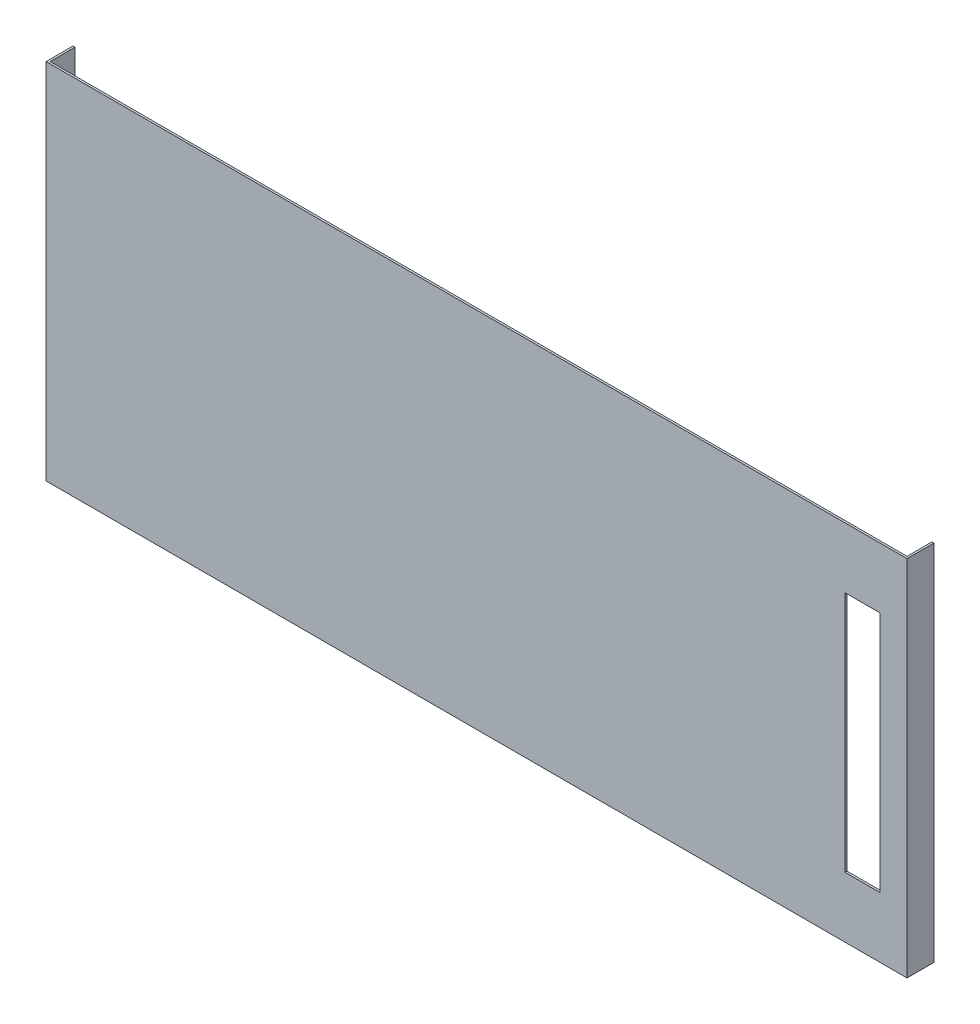
ISO-10303-21;
HEADER;
FILE_DESCRIPTION(('STEP AP214'),'2;1');
FILE_NAME('part.step','',(''),(''),'','','');
FILE_SCHEMA(('AUTOMOTIVE_DESIGN { 1 0 10303 214 1 1 1 1 }'));
ENDSEC;
DATA;
#1=APPLICATION_CONTEXT('core data for automotive mechanical design processes');
#2=APPLICATION_PROTOCOL_DEFINITION('international standard','automotive_design',2000,#1);
#3=PRODUCT_CONTEXT('',#1,'mechanical');
#4=PRODUCT('Part','Part','',(#3));
#5=PRODUCT_RELATED_PRODUCT_CATEGORY('part','',(#4));
#6=PRODUCT_DEFINITION_FORMATION('','',#4);
#7=PRODUCT_DEFINITION_CONTEXT('part definition',#1,'design');
#8=PRODUCT_DEFINITION('design','',#6,#7);
#9=PRODUCT_DEFINITION_SHAPE('','',#8);
#10=(LENGTH_UNIT() NAMED_UNIT(*) SI_UNIT(.MILLI.,.METRE.));
#11=(NAMED_UNIT(*) PLANE_ANGLE_UNIT() SI_UNIT($,.RADIAN.));
#12=(NAMED_UNIT(*) SI_UNIT($,.STERADIAN.) SOLID_ANGLE_UNIT());
#13=UNCERTAINTY_MEASURE_WITH_UNIT(LENGTH_MEASURE(1.E-05),#10,'distance_accuracy_value','');
#14=(GEOMETRIC_REPRESENTATION_CONTEXT(3) GLOBAL_UNCERTAINTY_ASSIGNED_CONTEXT((#13)) GLOBAL_UNIT_ASSIGNED_CONTEXT((#10,
#11,#12)) REPRESENTATION_CONTEXT('',''));
#15=CARTESIAN_POINT('',(0.,0.,0.));
#16=DIRECTION('',(0.,0.,1.));
#17=DIRECTION('',(1.,0.,0.));
#18=AXIS2_PLACEMENT_3D('',#15,#16,#17);
#19=CARTESIAN_POINT('',(670.,1950.,40.));
#20=DIRECTION('',(0.,0.,-1.));
#21=DIRECTION('',(-1.,0.,0.));
#22=AXIS2_PLACEMENT_3D('',#19,#20,#21);
#23=PLANE('',#22);
#24=DIRECTION('',(1.,0.,0.));
#25=VECTOR('',#24,1.);
#26=CARTESIAN_POINT('',(670.,1680.,40.));
#27=LINE('',#26,#25);
#28=CARTESIAN_POINT('',(30.,1680.,40.));
#29=VERTEX_POINT('',#28);
#30=CARTESIAN_POINT('',(670.,1680.,40.));
#31=VERTEX_POINT('',#30);
#32=EDGE_CURVE('E141',#29,#31,#27,.T.);
#33=ORIENTED_EDGE('',*,*,#32,.T.);
#34=DIRECTION('',(0.,-1.,0.));
#35=VECTOR('',#34,1.);
#36=CARTESIAN_POINT('',(670.,1950.,40.));
#37=LINE('',#36,#35);
#38=CARTESIAN_POINT('',(670.,1950.,40.));
#39=VERTEX_POINT('',#38);
#40=EDGE_CURVE('E200',#39,#31,#37,.T.);
#41=ORIENTED_EDGE('',*,*,#40,.F.);
#42=DIRECTION('',(1.,0.,0.));
#43=VECTOR('',#42,1.);
#44=CARTESIAN_POINT('',(670.,1950.,40.));
#45=LINE('',#44,#43);
#46=CARTESIAN_POINT('',(30.,1950.,40.));
#47=VERTEX_POINT('',#46);
#48=EDGE_CURVE('E149',#47,#39,#45,.T.);
#49=ORIENTED_EDGE('',*,*,#48,.F.);
#50=DIRECTION('',(0.,-1.,0.));
#51=VECTOR('',#50,1.);
#52=CARTESIAN_POINT('',(30.,1950.,40.));
#53=LINE('',#52,#51);
#54=EDGE_CURVE('E166',#47,#29,#53,.T.);
#55=ORIENTED_EDGE('',*,*,#54,.T.);
#56=EDGE_LOOP('',(#33,#41,#49,#55));
#57=FACE_BOUND('',#56,.T.);
#58=DIRECTION('',(0.,-1.,0.));
#59=VECTOR('',#58,1.);
#60=CARTESIAN_POINT('',(624.,1950.,40.));
#61=LINE('',#60,#59);
#62=CARTESIAN_POINT('',(624.,1905.,40.));
#63=VERTEX_POINT('',#62);
#64=CARTESIAN_POINT('',(624.,1725.,40.));
#65=VERTEX_POINT('',#64);
#66=EDGE_CURVE('E134',#63,#65,#61,.T.);
#67=ORIENTED_EDGE('',*,*,#66,.F.);
#68=DIRECTION('',(-1.,0.,0.));
#69=VECTOR('',#68,1.);
#70=CARTESIAN_POINT('',(670.,1905.,40.));
#71=LINE('',#70,#69);
#72=CARTESIAN_POINT('',(650.,1905.,40.));
#73=VERTEX_POINT('',#72);
#74=EDGE_CURVE('E123',#73,#63,#71,.T.);
#75=ORIENTED_EDGE('',*,*,#74,.F.);
#76=DIRECTION('',(0.,1.,0.));
#77=VECTOR('',#76,1.);
#78=CARTESIAN_POINT('',(650.,1950.,40.));
#79=LINE('',#78,#77);
#80=CARTESIAN_POINT('',(650.,1725.,40.));
#81=VERTEX_POINT('',#80);
#82=EDGE_CURVE('E128',#81,#73,#79,.T.);
#83=ORIENTED_EDGE('',*,*,#82,.F.);
#84=DIRECTION('',(1.,0.,0.));
#85=VECTOR('',#84,1.);
#86=CARTESIAN_POINT('',(670.,1725.,40.));
#87=LINE('',#86,#85);
#88=EDGE_CURVE('E140',#65,#81,#87,.T.);
#89=ORIENTED_EDGE('',*,*,#88,.F.);
#90=EDGE_LOOP('',(#67,#75,#83,#89));
#91=FACE_BOUND('',#90,.T.);
#92=ADVANCED_FACE('F39',(#57,#91),#23,.F.);
#93=CARTESIAN_POINT('',(31.5,1950.,38.5));
#94=DIRECTION('',(0.,0.,1.));
#95=DIRECTION('',(1.,0.,0.));
#96=AXIS2_PLACEMENT_3D('',#93,#94,#95);
#97=PLANE('',#96);
#98=DIRECTION('',(-1.,0.,0.));
#99=VECTOR('',#98,1.);
#100=CARTESIAN_POINT('',(31.5,1680.,38.5));
#101=LINE('',#100,#99);
#102=CARTESIAN_POINT('',(668.5,1680.,38.5));
#103=VERTEX_POINT('',#102);
#104=CARTESIAN_POINT('',(31.5,1680.,38.5));
#105=VERTEX_POINT('',#104);
#106=EDGE_CURVE('E173',#103,#105,#101,.T.);
#107=ORIENTED_EDGE('',*,*,#106,.T.);
#108=DIRECTION('',(0.,-1.,0.));
#109=VECTOR('',#108,1.);
#110=CARTESIAN_POINT('',(31.5,1950.,38.5));
#111=LINE('',#110,#109);
#112=CARTESIAN_POINT('',(31.5,1950.,38.5));
#113=VERTEX_POINT('',#112);
#114=EDGE_CURVE('E188',#113,#105,#111,.T.);
#115=ORIENTED_EDGE('',*,*,#114,.F.);
#116=DIRECTION('',(-1.,0.,0.));
#117=VECTOR('',#116,1.);
#118=CARTESIAN_POINT('',(31.5,1950.,38.5));
#119=LINE('',#118,#117);
#120=CARTESIAN_POINT('',(668.5,1950.,38.5));
#121=VERTEX_POINT('',#120);
#122=EDGE_CURVE('E159',#121,#113,#119,.T.);
#123=ORIENTED_EDGE('',*,*,#122,.F.);
#124=DIRECTION('',(0.,-1.,0.));
#125=VECTOR('',#124,1.);
#126=CARTESIAN_POINT('',(668.5,1950.,38.5));
#127=LINE('',#126,#125);
#128=EDGE_CURVE('E191',#121,#103,#127,.T.);
#129=ORIENTED_EDGE('',*,*,#128,.T.);
#130=EDGE_LOOP('',(#107,#115,#123,#129));
#131=FACE_BOUND('',#130,.T.);
#132=DIRECTION('',(0.,1.,0.));
#133=VECTOR('',#132,1.);
#134=CARTESIAN_POINT('',(624.,1950.,38.5));
#135=LINE('',#134,#133);
#136=CARTESIAN_POINT('',(624.,1725.,38.5));
#137=VERTEX_POINT('',#136);
#138=CARTESIAN_POINT('',(624.,1905.,38.5));
#139=VERTEX_POINT('',#138);
#140=EDGE_CURVE('E11',#137,#139,#135,.T.);
#141=ORIENTED_EDGE('',*,*,#140,.F.);
#142=DIRECTION('',(-1.,0.,0.));
#143=VECTOR('',#142,1.);
#144=CARTESIAN_POINT('',(31.5,1725.,38.5));
#145=LINE('',#144,#143);
#146=CARTESIAN_POINT('',(650.,1725.,38.5));
#147=VERTEX_POINT('',#146);
#148=EDGE_CURVE('E46',#147,#137,#145,.T.);
#149=ORIENTED_EDGE('',*,*,#148,.F.);
#150=DIRECTION('',(0.,-1.,0.));
#151=VECTOR('',#150,1.);
#152=CARTESIAN_POINT('',(650.,1950.,38.5));
#153=LINE('',#152,#151);
#154=CARTESIAN_POINT('',(650.,1905.,38.5));
#155=VERTEX_POINT('',#154);
#156=EDGE_CURVE('E205',#155,#147,#153,.T.);
#157=ORIENTED_EDGE('',*,*,#156,.F.);
#158=DIRECTION('',(1.,0.,0.));
#159=VECTOR('',#158,1.);
#160=CARTESIAN_POINT('',(31.5,1905.,38.5));
#161=LINE('',#160,#159);
#162=EDGE_CURVE('E203',#139,#155,#161,.T.);
#163=ORIENTED_EDGE('',*,*,#162,.F.);
#164=EDGE_LOOP('',(#141,#149,#157,#163));
#165=FACE_BOUND('',#164,.T.);
#166=ADVANCED_FACE('F215',(#131,#165),#97,.F.);
#167=CARTESIAN_POINT('',(670.,1950.,20.));
#168=DIRECTION('',(-1.,0.,0.));
#169=DIRECTION('',(0.,0.,1.));
#170=AXIS2_PLACEMENT_3D('',#167,#168,#169);
#171=PLANE('',#170);
#172=DIRECTION('',(0.,0.,-1.));
#173=VECTOR('',#172,1.);
#174=CARTESIAN_POINT('',(670.,1680.,20.));
#175=LINE('',#174,#173);
#176=CARTESIAN_POINT('',(670.,1680.,20.));
#177=VERTEX_POINT('',#176);
#178=EDGE_CURVE('E144',#31,#177,#175,.T.);
#179=ORIENTED_EDGE('',*,*,#178,.T.);
#180=DIRECTION('',(0.,-1.,0.));
#181=VECTOR('',#180,1.);
#182=CARTESIAN_POINT('',(670.,1950.,20.));
#183=LINE('',#182,#181);
#184=CARTESIAN_POINT('',(670.,1950.,20.));
#185=VERTEX_POINT('',#184);
#186=EDGE_CURVE('E197',#185,#177,#183,.T.);
#187=ORIENTED_EDGE('',*,*,#186,.F.);
#188=DIRECTION('',(0.,0.,-1.));
#189=VECTOR('',#188,1.);
#190=CARTESIAN_POINT('',(670.,1950.,20.));
#191=LINE('',#190,#189);
#192=EDGE_CURVE('E152',#39,#185,#191,.T.);
#193=ORIENTED_EDGE('',*,*,#192,.F.);
#194=ORIENTED_EDGE('',*,*,#40,.T.);
#195=EDGE_LOOP('',(#179,#187,#193,#194));
#196=FACE_BOUND('',#195,.T.);
#197=ADVANCED_FACE('F234',(#196),#171,.F.);
#198=CARTESIAN_POINT('',(668.5,1950.,20.));
#199=DIRECTION('',(0.,0.,1.));
#200=DIRECTION('',(1.,0.,0.));
#201=AXIS2_PLACEMENT_3D('',#198,#199,#200);
#202=PLANE('',#201);
#203=DIRECTION('',(-1.,0.,0.));
#204=VECTOR('',#203,1.);
#205=CARTESIAN_POINT('',(668.5,1680.,20.));
#206=LINE('',#205,#204);
#207=CARTESIAN_POINT('',(668.5,1680.,20.));
#208=VERTEX_POINT('',#207);
#209=EDGE_CURVE('E169',#177,#208,#206,.T.);
#210=ORIENTED_EDGE('',*,*,#209,.T.);
#211=DIRECTION('',(0.,-1.,0.));
#212=VECTOR('',#211,1.);
#213=CARTESIAN_POINT('',(668.5,1950.,20.));
#214=LINE('',#213,#212);
#215=CARTESIAN_POINT('',(668.5,1950.,20.));
#216=VERTEX_POINT('',#215);
#217=EDGE_CURVE('E194',#216,#208,#214,.T.);
#218=ORIENTED_EDGE('',*,*,#217,.F.);
#219=DIRECTION('',(-1.,0.,0.));
#220=VECTOR('',#219,1.);
#221=CARTESIAN_POINT('',(668.5,1950.,20.));
#222=LINE('',#221,#220);
#223=EDGE_CURVE('E155',#185,#216,#222,.T.);
#224=ORIENTED_EDGE('',*,*,#223,.F.);
#225=ORIENTED_EDGE('',*,*,#186,.T.);
#226=EDGE_LOOP('',(#210,#218,#224,#225));
#227=FACE_BOUND('',#226,.T.);
#228=ADVANCED_FACE('F273',(#227),#202,.F.);
#229=CARTESIAN_POINT('',(668.5,1950.,38.5));
#230=DIRECTION('',(1.,0.,0.));
#231=DIRECTION('',(0.,0.,-1.));
#232=AXIS2_PLACEMENT_3D('',#229,#230,#231);
#233=PLANE('',#232);
#234=DIRECTION('',(0.,0.,1.));
#235=VECTOR('',#234,1.);
#236=CARTESIAN_POINT('',(668.5,1680.,38.5));
#237=LINE('',#236,#235);
#238=EDGE_CURVE('E171',#208,#103,#237,.T.);
#239=ORIENTED_EDGE('',*,*,#238,.T.);
#240=ORIENTED_EDGE('',*,*,#128,.F.);
#241=DIRECTION('',(0.,0.,1.));
#242=VECTOR('',#241,1.);
#243=CARTESIAN_POINT('',(668.5,1950.,38.5));
#244=LINE('',#243,#242);
#245=EDGE_CURVE('E157',#216,#121,#244,.T.);
#246=ORIENTED_EDGE('',*,*,#245,.F.);
#247=ORIENTED_EDGE('',*,*,#217,.T.);
#248=EDGE_LOOP('',(#239,#240,#246,#247));
#249=FACE_BOUND('',#248,.T.);
#250=ADVANCED_FACE('F270',(#249),#233,.F.);
#251=CARTESIAN_POINT('',(31.5,1950.,20.));
#252=DIRECTION('',(-1.,0.,0.));
#253=DIRECTION('',(0.,0.,1.));
#254=AXIS2_PLACEMENT_3D('',#251,#252,#253);
#255=PLANE('',#254);
#256=DIRECTION('',(0.,0.,-1.));
#257=VECTOR('',#256,1.);
#258=CARTESIAN_POINT('',(31.5,1680.,20.));
#259=LINE('',#258,#257);
#260=CARTESIAN_POINT('',(31.5,1680.,20.));
#261=VERTEX_POINT('',#260);
#262=EDGE_CURVE('E175',#105,#261,#259,.T.);
#263=ORIENTED_EDGE('',*,*,#262,.T.);
#264=DIRECTION('',(0.,-1.,0.));
#265=VECTOR('',#264,1.);
#266=CARTESIAN_POINT('',(31.5,1950.,20.));
#267=LINE('',#266,#265);
#268=CARTESIAN_POINT('',(31.5,1950.,20.));
#269=VERTEX_POINT('',#268);
#270=EDGE_CURVE('E185',#269,#261,#267,.T.);
#271=ORIENTED_EDGE('',*,*,#270,.F.);
#272=DIRECTION('',(0.,0.,-1.));
#273=VECTOR('',#272,1.);
#274=CARTESIAN_POINT('',(31.5,1950.,20.));
#275=LINE('',#274,#273);
#276=EDGE_CURVE('E161',#113,#269,#275,.T.);
#277=ORIENTED_EDGE('',*,*,#276,.F.);
#278=ORIENTED_EDGE('',*,*,#114,.T.);
#279=EDGE_LOOP('',(#263,#271,#277,#278));
#280=FACE_BOUND('',#279,.T.);
#281=ADVANCED_FACE('F263',(#280),#255,.F.);
#282=CARTESIAN_POINT('',(30.,1950.,20.));
#283=DIRECTION('',(0.,0.,1.));
#284=DIRECTION('',(1.,0.,0.));
#285=AXIS2_PLACEMENT_3D('',#282,#283,#284);
#286=PLANE('',#285);
#287=DIRECTION('',(-1.,0.,0.));
#288=VECTOR('',#287,1.);
#289=CARTESIAN_POINT('',(30.,1680.,20.));
#290=LINE('',#289,#288);
#291=CARTESIAN_POINT('',(30.,1680.,20.));
#292=VERTEX_POINT('',#291);
#293=EDGE_CURVE('E177',#261,#292,#290,.T.);
#294=ORIENTED_EDGE('',*,*,#293,.T.);
#295=DIRECTION('',(0.,-1.,0.));
#296=VECTOR('',#295,1.);
#297=CARTESIAN_POINT('',(30.,1950.,20.));
#298=LINE('',#297,#296);
#299=CARTESIAN_POINT('',(30.,1950.,20.));
#300=VERTEX_POINT('',#299);
#301=EDGE_CURVE('E182',#300,#292,#298,.T.);
#302=ORIENTED_EDGE('',*,*,#301,.F.);
#303=DIRECTION('',(-1.,0.,0.));
#304=VECTOR('',#303,1.);
#305=CARTESIAN_POINT('',(30.,1950.,20.));
#306=LINE('',#305,#304);
#307=EDGE_CURVE('E163',#269,#300,#306,.T.);
#308=ORIENTED_EDGE('',*,*,#307,.F.);
#309=ORIENTED_EDGE('',*,*,#270,.T.);
#310=EDGE_LOOP('',(#294,#302,#308,#309));
#311=FACE_BOUND('',#310,.T.);
#312=ADVANCED_FACE('F258',(#311),#286,.F.);
#313=CARTESIAN_POINT('',(30.,1950.,40.));
#314=DIRECTION('',(1.,0.,0.));
#315=DIRECTION('',(0.,0.,-1.));
#316=AXIS2_PLACEMENT_3D('',#313,#314,#315);
#317=PLANE('',#316);
#318=DIRECTION('',(0.,0.,1.));
#319=VECTOR('',#318,1.);
#320=CARTESIAN_POINT('',(30.,1680.,40.));
#321=LINE('',#320,#319);
#322=EDGE_CURVE('E153',#292,#29,#321,.T.);
#323=ORIENTED_EDGE('',*,*,#322,.T.);
#324=ORIENTED_EDGE('',*,*,#54,.F.);
#325=DIRECTION('',(0.,0.,1.));
#326=VECTOR('',#325,1.);
#327=CARTESIAN_POINT('',(30.,1950.,40.));
#328=LINE('',#327,#326);
#329=EDGE_CURVE('E165',#300,#47,#328,.T.);
#330=ORIENTED_EDGE('',*,*,#329,.F.);
#331=ORIENTED_EDGE('',*,*,#301,.T.);
#332=EDGE_LOOP('',(#323,#324,#330,#331));
#333=FACE_BOUND('',#332,.T.);
#334=ADVANCED_FACE('F256',(#333),#317,.F.);
#335=CARTESIAN_POINT('',(0.,1950.,0.));
#336=DIRECTION('',(0.,-1.,0.));
#337=DIRECTION('',(0.,0.,-1.));
#338=AXIS2_PLACEMENT_3D('',#335,#336,#337);
#339=PLANE('',#338);
#340=ORIENTED_EDGE('',*,*,#48,.T.);
#341=ORIENTED_EDGE('',*,*,#192,.T.);
#342=ORIENTED_EDGE('',*,*,#223,.T.);
#343=ORIENTED_EDGE('',*,*,#245,.T.);
#344=ORIENTED_EDGE('',*,*,#122,.T.);
#345=ORIENTED_EDGE('',*,*,#276,.T.);
#346=ORIENTED_EDGE('',*,*,#307,.T.);
#347=ORIENTED_EDGE('',*,*,#329,.T.);
#348=EDGE_LOOP('',(#340,#341,#342,#343,#344,#345,#346,#347));
#349=FACE_BOUND('',#348,.T.);
#350=ADVANCED_FACE('F251',(#349),#339,.F.);
#351=CARTESIAN_POINT('',(0.,1680.,0.));
#352=DIRECTION('',(0.,-1.,0.));
#353=DIRECTION('',(0.,0.,-1.));
#354=AXIS2_PLACEMENT_3D('',#351,#352,#353);
#355=PLANE('',#354);
#356=ORIENTED_EDGE('',*,*,#32,.F.);
#357=ORIENTED_EDGE('',*,*,#322,.F.);
#358=ORIENTED_EDGE('',*,*,#293,.F.);
#359=ORIENTED_EDGE('',*,*,#262,.F.);
#360=ORIENTED_EDGE('',*,*,#106,.F.);
#361=ORIENTED_EDGE('',*,*,#238,.F.);
#362=ORIENTED_EDGE('',*,*,#209,.F.);
#363=ORIENTED_EDGE('',*,*,#178,.F.);
#364=EDGE_LOOP('',(#356,#357,#358,#359,#360,#361,#362,#363));
#365=FACE_BOUND('',#364,.T.);
#366=ADVANCED_FACE('F243',(#365),#355,.T.);
#367=CARTESIAN_POINT('',(624.,1725.,41.));
#368=DIRECTION('',(1.,0.,0.));
#369=DIRECTION('',(0.,0.,-1.));
#370=AXIS2_PLACEMENT_3D('',#367,#368,#369);
#371=PLANE('',#370);
#372=ORIENTED_EDGE('',*,*,#66,.T.);
#373=DIRECTION('',(0.,0.,-1.));
#374=VECTOR('',#373,1.);
#375=CARTESIAN_POINT('',(624.,1725.,41.));
#376=LINE('',#375,#374);
#377=EDGE_CURVE('E129',#65,#137,#376,.T.);
#378=ORIENTED_EDGE('',*,*,#377,.T.);
#379=ORIENTED_EDGE('',*,*,#140,.T.);
#380=DIRECTION('',(0.,0.,-1.));
#381=VECTOR('',#380,1.);
#382=CARTESIAN_POINT('',(624.,1905.,41.));
#383=LINE('',#382,#381);
#384=EDGE_CURVE('E58',#63,#139,#383,.T.);
#385=ORIENTED_EDGE('',*,*,#384,.F.);
#386=EDGE_LOOP('',(#372,#378,#379,#385));
#387=FACE_BOUND('',#386,.T.);
#388=ADVANCED_FACE('F132',(#387),#371,.T.);
#389=CARTESIAN_POINT('',(624.,1725.,41.));
#390=DIRECTION('',(0.,1.,0.));
#391=DIRECTION('',(0.,0.,1.));
#392=AXIS2_PLACEMENT_3D('',#389,#390,#391);
#393=PLANE('',#392);
#394=ORIENTED_EDGE('',*,*,#88,.T.);
#395=DIRECTION('',(0.,0.,-1.));
#396=VECTOR('',#395,1.);
#397=CARTESIAN_POINT('',(650.,1725.,41.));
#398=LINE('',#397,#396);
#399=EDGE_CURVE('E211',#81,#147,#398,.T.);
#400=ORIENTED_EDGE('',*,*,#399,.T.);
#401=ORIENTED_EDGE('',*,*,#148,.T.);
#402=ORIENTED_EDGE('',*,*,#377,.F.);
#403=EDGE_LOOP('',(#394,#400,#401,#402));
#404=FACE_BOUND('',#403,.T.);
#405=ADVANCED_FACE('F209',(#404),#393,.T.);
#406=CARTESIAN_POINT('',(650.,1725.,41.));
#407=DIRECTION('',(-1.,0.,0.));
#408=DIRECTION('',(0.,0.,1.));
#409=AXIS2_PLACEMENT_3D('',#406,#407,#408);
#410=PLANE('',#409);
#411=ORIENTED_EDGE('',*,*,#82,.T.);
#412=DIRECTION('',(0.,0.,-1.));
#413=VECTOR('',#412,1.);
#414=CARTESIAN_POINT('',(650.,1905.,41.));
#415=LINE('',#414,#413);
#416=EDGE_CURVE('E53',#73,#155,#415,.T.);
#417=ORIENTED_EDGE('',*,*,#416,.T.);
#418=ORIENTED_EDGE('',*,*,#156,.T.);
#419=ORIENTED_EDGE('',*,*,#399,.F.);
#420=EDGE_LOOP('',(#411,#417,#418,#419));
#421=FACE_BOUND('',#420,.T.);
#422=ADVANCED_FACE('F217',(#421),#410,.T.);
#423=CARTESIAN_POINT('',(624.,1905.,41.));
#424=DIRECTION('',(0.,-1.,0.));
#425=DIRECTION('',(0.,0.,-1.));
#426=AXIS2_PLACEMENT_3D('',#423,#424,#425);
#427=PLANE('',#426);
#428=ORIENTED_EDGE('',*,*,#74,.T.);
#429=ORIENTED_EDGE('',*,*,#384,.T.);
#430=ORIENTED_EDGE('',*,*,#162,.T.);
#431=ORIENTED_EDGE('',*,*,#416,.F.);
#432=EDGE_LOOP('',(#428,#429,#430,#431));
#433=FACE_BOUND('',#432,.T.);
#434=ADVANCED_FACE('F124',(#433),#427,.T.);
#435=CLOSED_SHELL('',(#92,#166,#197,#228,#250,#281,#312,#334,#350,#366,#388,#405,#422,#434));
#436=MANIFOLD_SOLID_BREP('B2',#435);
#437=ADVANCED_BREP_SHAPE_REPRESENTATION('',(#18,#436),#14);
#438=SHAPE_DEFINITION_REPRESENTATION(#9,#437);
ENDSEC;
END-ISO-10303-21;
